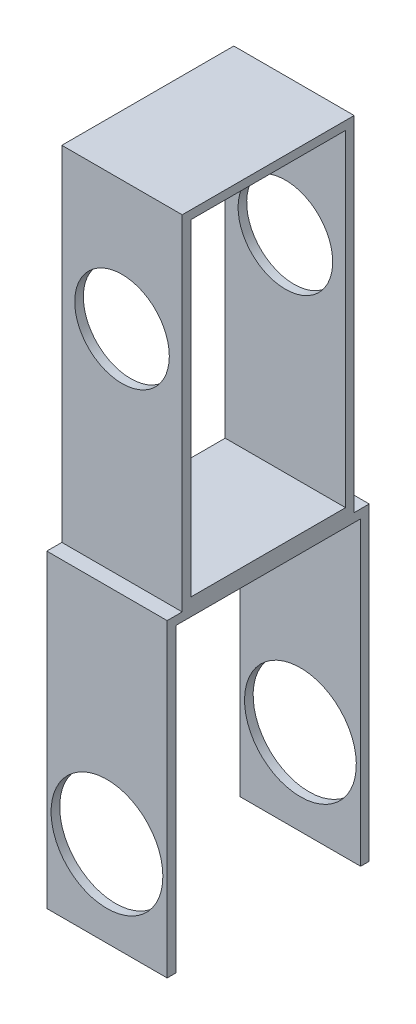
ISO-10303-21;
HEADER;
FILE_DESCRIPTION(('STEP AP214'),'2;1');
FILE_NAME('part.step','',(''),(''),'','','');
FILE_SCHEMA(('AUTOMOTIVE_DESIGN { 1 0 10303 214 1 1 1 1 }'));
ENDSEC;
DATA;
#1=APPLICATION_CONTEXT('core data for automotive mechanical design processes');
#2=APPLICATION_PROTOCOL_DEFINITION('international standard','automotive_design',2000,#1);
#3=PRODUCT_CONTEXT('',#1,'mechanical');
#4=PRODUCT('Part','Part','',(#3));
#5=PRODUCT_RELATED_PRODUCT_CATEGORY('part','',(#4));
#6=PRODUCT_DEFINITION_FORMATION('','',#4);
#7=PRODUCT_DEFINITION_CONTEXT('part definition',#1,'design');
#8=PRODUCT_DEFINITION('design','',#6,#7);
#9=PRODUCT_DEFINITION_SHAPE('','',#8);
#10=(LENGTH_UNIT() NAMED_UNIT(*) SI_UNIT(.MILLI.,.METRE.));
#11=(NAMED_UNIT(*) PLANE_ANGLE_UNIT() SI_UNIT($,.RADIAN.));
#12=(NAMED_UNIT(*) SI_UNIT($,.STERADIAN.) SOLID_ANGLE_UNIT());
#13=UNCERTAINTY_MEASURE_WITH_UNIT(LENGTH_MEASURE(1.E-05),#10,'distance_accuracy_value','');
#14=(GEOMETRIC_REPRESENTATION_CONTEXT(3) GLOBAL_UNCERTAINTY_ASSIGNED_CONTEXT((#13)) GLOBAL_UNIT_ASSIGNED_CONTEXT((#10,
#11,#12)) REPRESENTATION_CONTEXT('',''));
#15=CARTESIAN_POINT('',(0.,0.,0.));
#16=DIRECTION('',(0.,0.,1.));
#17=DIRECTION('',(1.,0.,0.));
#18=AXIS2_PLACEMENT_3D('',#15,#16,#17);
#19=CARTESIAN_POINT('',(14.,0.,40.));
#20=DIRECTION('',(1.,0.,0.));
#21=DIRECTION('',(0.,1.,0.));
#22=AXIS2_PLACEMENT_3D('',#19,#20,#21);
#23=PLANE('',#22);
#24=DIRECTION('',(0.,-1.,0.));
#25=VECTOR('',#24,1.);
#26=CARTESIAN_POINT('',(14.,0.,38.));
#27=LINE('',#26,#25);
#28=CARTESIAN_POINT('',(14.,73.9999999999998,38.));
#29=VERTEX_POINT('',#28);
#30=CARTESIAN_POINT('',(14.,-2.00000000000016,38.));
#31=VERTEX_POINT('',#30);
#32=EDGE_CURVE('E61',#29,#31,#27,.T.);
#33=ORIENTED_EDGE('',*,*,#32,.F.);
#34=DIRECTION('',(0.,0.,-1.));
#35=VECTOR('',#34,1.);
#36=CARTESIAN_POINT('',(14.,73.9999999999998,0.));
#37=LINE('',#36,#35);
#38=CARTESIAN_POINT('',(14.,73.9999999999998,2.00000000000001));
#39=VERTEX_POINT('',#38);
#40=EDGE_CURVE('E196',#29,#39,#37,.T.);
#41=ORIENTED_EDGE('',*,*,#40,.T.);
#42=DIRECTION('',(0.,-1.,0.));
#43=VECTOR('',#42,1.);
#44=CARTESIAN_POINT('',(14.,0.,2.));
#45=LINE('',#44,#43);
#46=CARTESIAN_POINT('',(14.,-2.00000000000016,2.));
#47=VERTEX_POINT('',#46);
#48=EDGE_CURVE('E209',#39,#47,#45,.T.);
#49=ORIENTED_EDGE('',*,*,#48,.T.);
#50=DIRECTION('',(0.,0.,-1.));
#51=VECTOR('',#50,1.);
#52=CARTESIAN_POINT('',(14.,-2.00000000000016,0.));
#53=LINE('',#52,#51);
#54=EDGE_CURVE('E206',#31,#47,#53,.T.);
#55=ORIENTED_EDGE('',*,*,#54,.F.);
#56=EDGE_LOOP('',(#33,#41,#49,#55));
#57=FACE_BOUND('',#56,.T.);
#58=DIRECTION('',(0.,0.,-1.));
#59=VECTOR('',#58,1.);
#60=CARTESIAN_POINT('',(14.,-6.00000000000015,0.));
#61=LINE('',#60,#59);
#62=CARTESIAN_POINT('',(14.,-6.00000000000015,41.5));
#63=VERTEX_POINT('',#62);
#64=CARTESIAN_POINT('',(14.,-6.00000000000015,-1.5));
#65=VERTEX_POINT('',#64);
#66=EDGE_CURVE('E175',#63,#65,#61,.T.);
#67=ORIENTED_EDGE('',*,*,#66,.T.);
#68=DIRECTION('',(0.,-1.,0.));
#69=VECTOR('',#68,1.);
#70=CARTESIAN_POINT('',(14.,0.,-1.5));
#71=LINE('',#70,#69);
#72=CARTESIAN_POINT('',(14.,-76.0000000000002,-1.50000000000001));
#73=VERTEX_POINT('',#72);
#74=EDGE_CURVE('E167',#65,#73,#71,.T.);
#75=ORIENTED_EDGE('',*,*,#74,.T.);
#76=DIRECTION('',(0.,0.,-1.));
#77=VECTOR('',#76,1.);
#78=CARTESIAN_POINT('',(14.,-76.0000000000002,43.5));
#79=LINE('',#78,#77);
#80=CARTESIAN_POINT('',(14.,-76.0000000000002,-3.5));
#81=VERTEX_POINT('',#80);
#82=EDGE_CURVE('E262',#73,#81,#79,.T.);
#83=ORIENTED_EDGE('',*,*,#82,.T.);
#84=DIRECTION('',(0.,-1.,0.));
#85=VECTOR('',#84,1.);
#86=CARTESIAN_POINT('',(14.,0.,-3.5));
#87=LINE('',#86,#85);
#88=CARTESIAN_POINT('',(14.,-4.00000000000016,-3.5));
#89=VERTEX_POINT('',#88);
#90=EDGE_CURVE('E231',#89,#81,#87,.T.);
#91=ORIENTED_EDGE('',*,*,#90,.F.);
#92=DIRECTION('',(0.,0.,1.));
#93=VECTOR('',#92,1.);
#94=CARTESIAN_POINT('',(14.,-4.00000000000016,-3.5));
#95=LINE('',#94,#93);
#96=CARTESIAN_POINT('',(14.,-4.00000000000016,0.));
#97=VERTEX_POINT('',#96);
#98=EDGE_CURVE('E242',#89,#97,#95,.T.);
#99=ORIENTED_EDGE('',*,*,#98,.T.);
#100=DIRECTION('',(0.,-1.,0.));
#101=VECTOR('',#100,1.);
#102=CARTESIAN_POINT('',(14.,0.,0.));
#103=LINE('',#102,#101);
#104=CARTESIAN_POINT('',(14.,75.9999999999998,0.));
#105=VERTEX_POINT('',#104);
#106=EDGE_CURVE('E293',#105,#97,#103,.T.);
#107=ORIENTED_EDGE('',*,*,#106,.F.);
#108=DIRECTION('',(0.,0.,-1.));
#109=VECTOR('',#108,1.);
#110=CARTESIAN_POINT('',(14.,75.9999999999998,40.));
#111=LINE('',#110,#109);
#112=CARTESIAN_POINT('',(14.,75.9999999999998,40.));
#113=VERTEX_POINT('',#112);
#114=EDGE_CURVE('E11',#113,#105,#111,.T.);
#115=ORIENTED_EDGE('',*,*,#114,.F.);
#116=DIRECTION('',(0.,-1.,0.));
#117=VECTOR('',#116,1.);
#118=CARTESIAN_POINT('',(14.,0.,40.));
#119=LINE('',#118,#117);
#120=CARTESIAN_POINT('',(14.,-4.00000000000016,40.));
#121=VERTEX_POINT('',#120);
#122=EDGE_CURVE('E283',#113,#121,#119,.T.);
#123=ORIENTED_EDGE('',*,*,#122,.T.);
#124=DIRECTION('',(0.,0.,-1.));
#125=VECTOR('',#124,1.);
#126=CARTESIAN_POINT('',(14.,-4.00000000000016,43.5));
#127=LINE('',#126,#125);
#128=CARTESIAN_POINT('',(14.,-4.00000000000016,43.5));
#129=VERTEX_POINT('',#128);
#130=EDGE_CURVE('E272',#129,#121,#127,.T.);
#131=ORIENTED_EDGE('',*,*,#130,.F.);
#132=DIRECTION('',(0.,-1.,0.));
#133=VECTOR('',#132,1.);
#134=CARTESIAN_POINT('',(14.,0.,43.5));
#135=LINE('',#134,#133);
#136=CARTESIAN_POINT('',(14.,-76.0000000000002,43.5));
#137=VERTEX_POINT('',#136);
#138=EDGE_CURVE('E251',#129,#137,#135,.T.);
#139=ORIENTED_EDGE('',*,*,#138,.T.);
#140=CARTESIAN_POINT('',(14.,-76.0000000000002,41.5));
#141=VERTEX_POINT('',#140);
#142=EDGE_CURVE('E263',#137,#141,#79,.T.);
#143=ORIENTED_EDGE('',*,*,#142,.T.);
#144=DIRECTION('',(0.,-1.,0.));
#145=VECTOR('',#144,1.);
#146=CARTESIAN_POINT('',(14.,0.,41.5));
#147=LINE('',#146,#145);
#148=EDGE_CURVE('E53',#63,#141,#147,.T.);
#149=ORIENTED_EDGE('',*,*,#148,.F.);
#150=EDGE_LOOP('',(#67,#75,#83,#91,#99,#107,#115,#123,#131,#139,#143,#149));
#151=FACE_BOUND('',#150,.T.);
#152=ADVANCED_FACE('F38',(#57,#151),#23,.T.);
#153=CARTESIAN_POINT('',(-14.,0.,40.));
#154=DIRECTION('',(1.,0.,0.));
#155=DIRECTION('',(0.,1.,0.));
#156=AXIS2_PLACEMENT_3D('',#153,#154,#155);
#157=PLANE('',#156);
#158=DIRECTION('',(0.,0.,-1.));
#159=VECTOR('',#158,1.);
#160=CARTESIAN_POINT('',(-14.,73.9999999999998,0.));
#161=LINE('',#160,#159);
#162=CARTESIAN_POINT('',(-14.,73.9999999999998,38.));
#163=VERTEX_POINT('',#162);
#164=CARTESIAN_POINT('',(-14.,73.9999999999998,2.00000000000001));
#165=VERTEX_POINT('',#164);
#166=EDGE_CURVE('E202',#163,#165,#161,.T.);
#167=ORIENTED_EDGE('',*,*,#166,.F.);
#168=DIRECTION('',(0.,-1.,0.));
#169=VECTOR('',#168,1.);
#170=CARTESIAN_POINT('',(-14.,0.,38.));
#171=LINE('',#170,#169);
#172=CARTESIAN_POINT('',(-14.,-2.00000000000017,38.));
#173=VERTEX_POINT('',#172);
#174=EDGE_CURVE('E192',#163,#173,#171,.T.);
#175=ORIENTED_EDGE('',*,*,#174,.T.);
#176=DIRECTION('',(0.,0.,-1.));
#177=VECTOR('',#176,1.);
#178=CARTESIAN_POINT('',(-14.,-2.00000000000017,0.));
#179=LINE('',#178,#177);
#180=CARTESIAN_POINT('',(-14.,-2.00000000000017,2.));
#181=VERTEX_POINT('',#180);
#182=EDGE_CURVE('E195',#173,#181,#179,.T.);
#183=ORIENTED_EDGE('',*,*,#182,.T.);
#184=DIRECTION('',(0.,-1.,0.));
#185=VECTOR('',#184,1.);
#186=CARTESIAN_POINT('',(-14.,0.,2.));
#187=LINE('',#186,#185);
#188=EDGE_CURVE('E199',#165,#181,#187,.T.);
#189=ORIENTED_EDGE('',*,*,#188,.F.);
#190=EDGE_LOOP('',(#167,#175,#183,#189));
#191=FACE_BOUND('',#190,.T.);
#192=DIRECTION('',(0.,-1.,0.));
#193=VECTOR('',#192,1.);
#194=CARTESIAN_POINT('',(-14.,0.,-1.5));
#195=LINE('',#194,#193);
#196=CARTESIAN_POINT('',(-14.,-6.00000000000016,-1.5));
#197=VERTEX_POINT('',#196);
#198=CARTESIAN_POINT('',(-14.,-76.0000000000002,-1.50000000000001));
#199=VERTEX_POINT('',#198);
#200=EDGE_CURVE('E161',#197,#199,#195,.T.);
#201=ORIENTED_EDGE('',*,*,#200,.F.);
#202=DIRECTION('',(0.,0.,-1.));
#203=VECTOR('',#202,1.);
#204=CARTESIAN_POINT('',(-14.,-6.00000000000016,0.));
#205=LINE('',#204,#203);
#206=CARTESIAN_POINT('',(-14.,-6.00000000000016,41.5));
#207=VERTEX_POINT('',#206);
#208=EDGE_CURVE('E149',#207,#197,#205,.T.);
#209=ORIENTED_EDGE('',*,*,#208,.F.);
#210=DIRECTION('',(0.,-1.,0.));
#211=VECTOR('',#210,1.);
#212=CARTESIAN_POINT('',(-14.,0.,41.5));
#213=LINE('',#212,#211);
#214=CARTESIAN_POINT('',(-14.,-76.0000000000002,41.5));
#215=VERTEX_POINT('',#214);
#216=EDGE_CURVE('E160',#207,#215,#213,.T.);
#217=ORIENTED_EDGE('',*,*,#216,.T.);
#218=DIRECTION('',(0.,0.,-1.));
#219=VECTOR('',#218,1.);
#220=CARTESIAN_POINT('',(-14.,-76.0000000000002,43.5));
#221=LINE('',#220,#219);
#222=CARTESIAN_POINT('',(-14.,-76.0000000000002,43.5));
#223=VERTEX_POINT('',#222);
#224=EDGE_CURVE('E266',#223,#215,#221,.T.);
#225=ORIENTED_EDGE('',*,*,#224,.F.);
#226=DIRECTION('',(0.,-1.,0.));
#227=VECTOR('',#226,1.);
#228=CARTESIAN_POINT('',(-14.,0.,43.5));
#229=LINE('',#228,#227);
#230=CARTESIAN_POINT('',(-14.,-4.00000000000016,43.5));
#231=VERTEX_POINT('',#230);
#232=EDGE_CURVE('E257',#231,#223,#229,.T.);
#233=ORIENTED_EDGE('',*,*,#232,.F.);
#234=DIRECTION('',(0.,0.,-1.));
#235=VECTOR('',#234,1.);
#236=CARTESIAN_POINT('',(-14.,-4.00000000000016,43.5));
#237=LINE('',#236,#235);
#238=CARTESIAN_POINT('',(-14.,-4.00000000000016,40.));
#239=VERTEX_POINT('',#238);
#240=EDGE_CURVE('E269',#231,#239,#237,.T.);
#241=ORIENTED_EDGE('',*,*,#240,.T.);
#242=DIRECTION('',(0.,-1.,0.));
#243=VECTOR('',#242,1.);
#244=CARTESIAN_POINT('',(-14.,0.,40.));
#245=LINE('',#244,#243);
#246=CARTESIAN_POINT('',(-14.,75.9999999999998,40.));
#247=VERTEX_POINT('',#246);
#248=EDGE_CURVE('E289',#247,#239,#245,.T.);
#249=ORIENTED_EDGE('',*,*,#248,.F.);
#250=DIRECTION('',(0.,0.,-1.));
#251=VECTOR('',#250,1.);
#252=CARTESIAN_POINT('',(-14.,75.9999999999998,40.));
#253=LINE('',#252,#251);
#254=CARTESIAN_POINT('',(-14.,75.9999999999998,0.));
#255=VERTEX_POINT('',#254);
#256=EDGE_CURVE('E46',#247,#255,#253,.T.);
#257=ORIENTED_EDGE('',*,*,#256,.T.);
#258=DIRECTION('',(0.,-1.,0.));
#259=VECTOR('',#258,1.);
#260=CARTESIAN_POINT('',(-14.,0.,0.));
#261=LINE('',#260,#259);
#262=CARTESIAN_POINT('',(-14.,-4.00000000000016,0.));
#263=VERTEX_POINT('',#262);
#264=EDGE_CURVE('E280',#255,#263,#261,.T.);
#265=ORIENTED_EDGE('',*,*,#264,.T.);
#266=DIRECTION('',(0.,0.,1.));
#267=VECTOR('',#266,1.);
#268=CARTESIAN_POINT('',(-14.,-4.00000000000016,-3.5));
#269=LINE('',#268,#267);
#270=CARTESIAN_POINT('',(-14.,-4.00000000000016,-3.5));
#271=VERTEX_POINT('',#270);
#272=EDGE_CURVE('E245',#271,#263,#269,.T.);
#273=ORIENTED_EDGE('',*,*,#272,.F.);
#274=DIRECTION('',(0.,-1.,0.));
#275=VECTOR('',#274,1.);
#276=CARTESIAN_POINT('',(-14.,0.,-3.5));
#277=LINE('',#276,#275);
#278=CARTESIAN_POINT('',(-14.,-76.0000000000002,-3.5));
#279=VERTEX_POINT('',#278);
#280=EDGE_CURVE('E237',#271,#279,#277,.T.);
#281=ORIENTED_EDGE('',*,*,#280,.T.);
#282=EDGE_CURVE('E173',#199,#279,#221,.T.);
#283=ORIENTED_EDGE('',*,*,#282,.F.);
#284=EDGE_LOOP('',(#201,#209,#217,#225,#233,#241,#249,#257,#265,#273,#281,#283));
#285=FACE_BOUND('',#284,.T.);
#286=ADVANCED_FACE('F171',(#191,#285),#157,.F.);
#287=CARTESIAN_POINT('',(0.,-56.0000000000001,43.5));
#288=DIRECTION('',(0.,0.,-1.));
#289=DIRECTION('',(-1.,0.,0.));
#290=AXIS2_PLACEMENT_3D('',#287,#288,#289);
#291=CYLINDRICAL_SURFACE('',#290,13.);
#292=CARTESIAN_POINT('',(0.,-56.0000000000001,-3.5));
#293=DIRECTION('',(0.,0.,1.));
#294=DIRECTION('',(1.,0.,0.));
#295=AXIS2_PLACEMENT_3D('',#292,#293,#294);
#296=CIRCLE('',#295,13.);
#297=CARTESIAN_POINT('',(13.,-56.0000000000001,-3.5));
#298=VERTEX_POINT('',#297);
#299=EDGE_CURVE('E228',#298,#298,#296,.T.);
#300=ORIENTED_EDGE('',*,*,#299,.F.);
#301=EDGE_LOOP('',(#300));
#302=FACE_BOUND('',#301,.T.);
#303=CARTESIAN_POINT('',(0.,-56.0000000000001,-1.50000000000001));
#304=DIRECTION('',(0.,0.,1.));
#305=DIRECTION('',(0.,-1.,0.));
#306=AXIS2_PLACEMENT_3D('',#303,#304,#305);
#307=CIRCLE('',#306,13.);
#308=CARTESIAN_POINT('',(0.,-69.0000000000001,-1.50000000000001));
#309=VERTEX_POINT('',#308);
#310=EDGE_CURVE('E189',#309,#309,#307,.T.);
#311=ORIENTED_EDGE('',*,*,#310,.T.);
#312=EDGE_LOOP('',(#311));
#313=FACE_BOUND('',#312,.T.);
#314=ADVANCED_FACE('F355',(#302,#313),#291,.F.);
#315=CARTESIAN_POINT('',(0.,-76.0000000000002,43.5));
#316=DIRECTION('',(0.,1.,0.));
#317=DIRECTION('',(0.,0.,1.));
#318=AXIS2_PLACEMENT_3D('',#315,#316,#317);
#319=PLANE('',#318);
#320=DIRECTION('',(1.,0.,0.));
#321=VECTOR('',#320,1.);
#322=CARTESIAN_POINT('',(-14.,-76.0000000000002,-1.50000000000001));
#323=LINE('',#322,#321);
#324=EDGE_CURVE('E181',#199,#73,#323,.T.);
#325=ORIENTED_EDGE('',*,*,#324,.F.);
#326=ORIENTED_EDGE('',*,*,#282,.T.);
#327=DIRECTION('',(1.,0.,0.));
#328=VECTOR('',#327,1.);
#329=CARTESIAN_POINT('',(0.,-76.0000000000002,-3.5));
#330=LINE('',#329,#328);
#331=EDGE_CURVE('E239',#279,#81,#330,.T.);
#332=ORIENTED_EDGE('',*,*,#331,.T.);
#333=ORIENTED_EDGE('',*,*,#82,.F.);
#334=EDGE_LOOP('',(#325,#326,#332,#333));
#335=FACE_BOUND('',#334,.T.);
#336=ADVANCED_FACE('F322',(#335),#319,.F.);
#337=CARTESIAN_POINT('',(0.,45.9999999999998,40.));
#338=DIRECTION('',(0.,0.,-1.));
#339=DIRECTION('',(-1.,0.,0.));
#340=AXIS2_PLACEMENT_3D('',#337,#338,#339);
#341=CYLINDRICAL_SURFACE('',#340,11.);
#342=CARTESIAN_POINT('',(0.,45.9999999999998,0.));
#343=DIRECTION('',(0.,0.,1.));
#344=DIRECTION('',(1.,0.,0.));
#345=AXIS2_PLACEMENT_3D('',#342,#343,#344);
#346=CIRCLE('',#345,11.);
#347=CARTESIAN_POINT('',(11.,45.9999999999998,0.));
#348=VERTEX_POINT('',#347);
#349=EDGE_CURVE('E275',#348,#348,#346,.T.);
#350=ORIENTED_EDGE('',*,*,#349,.F.);
#351=EDGE_LOOP('',(#350));
#352=FACE_BOUND('',#351,.T.);
#353=CARTESIAN_POINT('',(0.,45.9999999999998,2.00000000000001));
#354=DIRECTION('',(0.,0.,1.));
#355=DIRECTION('',(0.,-1.,0.));
#356=AXIS2_PLACEMENT_3D('',#353,#354,#355);
#357=CIRCLE('',#356,11.);
#358=CARTESIAN_POINT('',(0.,34.9999999999999,2.00000000000001));
#359=VERTEX_POINT('',#358);
#360=EDGE_CURVE('E216',#359,#359,#357,.T.);
#361=ORIENTED_EDGE('',*,*,#360,.T.);
#362=EDGE_LOOP('',(#361));
#363=FACE_BOUND('',#362,.T.);
#364=ADVANCED_FACE('F347',(#352,#363),#341,.F.);
#365=CARTESIAN_POINT('',(0.,75.9999999999998,40.));
#366=DIRECTION('',(0.,1.,0.));
#367=DIRECTION('',(0.,0.,1.));
#368=AXIS2_PLACEMENT_3D('',#365,#366,#367);
#369=PLANE('',#368);
#370=DIRECTION('',(1.,0.,0.));
#371=VECTOR('',#370,1.);
#372=CARTESIAN_POINT('',(0.,75.9999999999998,0.));
#373=LINE('',#372,#371);
#374=EDGE_CURVE('E296',#255,#105,#373,.T.);
#375=ORIENTED_EDGE('',*,*,#374,.F.);
#376=ORIENTED_EDGE('',*,*,#256,.F.);
#377=DIRECTION('',(1.,0.,0.));
#378=VECTOR('',#377,1.);
#379=CARTESIAN_POINT('',(0.,75.9999999999998,40.));
#380=LINE('',#379,#378);
#381=EDGE_CURVE('E286',#247,#113,#380,.T.);
#382=ORIENTED_EDGE('',*,*,#381,.T.);
#383=ORIENTED_EDGE('',*,*,#114,.T.);
#384=EDGE_LOOP('',(#375,#376,#382,#383));
#385=FACE_BOUND('',#384,.T.);
#386=ADVANCED_FACE('F308',(#385),#369,.T.);
#387=CARTESIAN_POINT('',(0.,45.9999999999998,38.));
#388=DIRECTION('',(0.,0.,1.));
#389=DIRECTION('',(0.,-1.,0.));
#390=AXIS2_PLACEMENT_3D('',#387,#388,#389);
#391=CIRCLE('',#390,11.);
#392=CARTESIAN_POINT('',(0.,34.9999999999999,38.));
#393=VERTEX_POINT('',#392);
#394=EDGE_CURVE('E224',#393,#393,#391,.T.);
#395=ORIENTED_EDGE('',*,*,#394,.F.);
#396=EDGE_LOOP('',(#395));
#397=FACE_BOUND('',#396,.T.);
#398=CARTESIAN_POINT('',(0.,45.9999999999998,40.));
#399=DIRECTION('',(0.,0.,1.));
#400=DIRECTION('',(1.,0.,0.));
#401=AXIS2_PLACEMENT_3D('',#398,#399,#400);
#402=CIRCLE('',#401,11.);
#403=CARTESIAN_POINT('',(11.,45.9999999999998,40.));
#404=VERTEX_POINT('',#403);
#405=EDGE_CURVE('E276',#404,#404,#402,.T.);
#406=ORIENTED_EDGE('',*,*,#405,.T.);
#407=EDGE_LOOP('',(#406));
#408=FACE_BOUND('',#407,.T.);
#409=ADVANCED_FACE('F40',(#397,#408),#341,.F.);
#410=CARTESIAN_POINT('',(0.,0.,40.));
#411=DIRECTION('',(0.,0.,1.));
#412=DIRECTION('',(1.,0.,0.));
#413=AXIS2_PLACEMENT_3D('',#410,#411,#412);
#414=PLANE('',#413);
#415=ORIENTED_EDGE('',*,*,#405,.F.);
#416=EDGE_LOOP('',(#415));
#417=FACE_BOUND('',#416,.T.);
#418=DIRECTION('',(-1.,0.,0.));
#419=VECTOR('',#418,1.);
#420=CARTESIAN_POINT('',(0.,-4.00000000000016,40.));
#421=LINE('',#420,#419);
#422=EDGE_CURVE('E279',#121,#239,#421,.T.);
#423=ORIENTED_EDGE('',*,*,#422,.F.);
#424=ORIENTED_EDGE('',*,*,#122,.F.);
#425=ORIENTED_EDGE('',*,*,#381,.F.);
#426=ORIENTED_EDGE('',*,*,#248,.T.);
#427=EDGE_LOOP('',(#423,#424,#425,#426));
#428=FACE_BOUND('',#427,.T.);
#429=ADVANCED_FACE('F336',(#417,#428),#414,.T.);
#430=CARTESIAN_POINT('',(0.,0.,0.));
#431=DIRECTION('',(0.,0.,1.));
#432=DIRECTION('',(1.,0.,0.));
#433=AXIS2_PLACEMENT_3D('',#430,#431,#432);
#434=PLANE('',#433);
#435=ORIENTED_EDGE('',*,*,#349,.T.);
#436=EDGE_LOOP('',(#435));
#437=FACE_BOUND('',#436,.T.);
#438=ORIENTED_EDGE('',*,*,#106,.T.);
#439=DIRECTION('',(-1.,0.,0.));
#440=VECTOR('',#439,1.);
#441=CARTESIAN_POINT('',(0.,-4.00000000000016,0.));
#442=LINE('',#441,#440);
#443=EDGE_CURVE('E227',#97,#263,#442,.T.);
#444=ORIENTED_EDGE('',*,*,#443,.T.);
#445=ORIENTED_EDGE('',*,*,#264,.F.);
#446=ORIENTED_EDGE('',*,*,#374,.T.);
#447=EDGE_LOOP('',(#438,#444,#445,#446));
#448=FACE_BOUND('',#447,.T.);
#449=ADVANCED_FACE('F306',(#437,#448),#434,.F.);
#450=CARTESIAN_POINT('',(0.,-4.00000000000016,43.5));
#451=DIRECTION('',(0.,-1.,0.));
#452=DIRECTION('',(0.,0.,-1.));
#453=AXIS2_PLACEMENT_3D('',#450,#451,#452);
#454=PLANE('',#453);
#455=ORIENTED_EDGE('',*,*,#130,.T.);
#456=ORIENTED_EDGE('',*,*,#422,.T.);
#457=ORIENTED_EDGE('',*,*,#240,.F.);
#458=DIRECTION('',(-1.,0.,0.));
#459=VECTOR('',#458,1.);
#460=CARTESIAN_POINT('',(0.,-4.00000000000016,43.5));
#461=LINE('',#460,#459);
#462=EDGE_CURVE('E254',#129,#231,#461,.T.);
#463=ORIENTED_EDGE('',*,*,#462,.F.);
#464=EDGE_LOOP('',(#455,#456,#457,#463));
#465=FACE_BOUND('',#464,.T.);
#466=ADVANCED_FACE('F334',(#465),#454,.F.);
#467=CARTESIAN_POINT('',(0.,-56.0000000000001,41.5));
#468=DIRECTION('',(0.,0.,1.));
#469=DIRECTION('',(1.,0.,0.));
#470=AXIS2_PLACEMENT_3D('',#467,#468,#469);
#471=CIRCLE('',#470,13.);
#472=CARTESIAN_POINT('',(13.,-56.0000000000001,41.5));
#473=VERTEX_POINT('',#472);
#474=EDGE_CURVE('E183',#473,#473,#471,.T.);
#475=ORIENTED_EDGE('',*,*,#474,.F.);
#476=EDGE_LOOP('',(#475));
#477=FACE_BOUND('',#476,.T.);
#478=CARTESIAN_POINT('',(0.,-56.0000000000001,43.5));
#479=DIRECTION('',(0.,0.,1.));
#480=DIRECTION('',(1.,0.,0.));
#481=AXIS2_PLACEMENT_3D('',#478,#479,#480);
#482=CIRCLE('',#481,13.);
#483=CARTESIAN_POINT('',(13.,-56.0000000000001,43.5));
#484=VERTEX_POINT('',#483);
#485=EDGE_CURVE('E247',#484,#484,#482,.T.);
#486=ORIENTED_EDGE('',*,*,#485,.T.);
#487=EDGE_LOOP('',(#486));
#488=FACE_BOUND('',#487,.T.);
#489=ADVANCED_FACE('F407',(#477,#488),#291,.F.);
#490=ORIENTED_EDGE('',*,*,#224,.T.);
#491=DIRECTION('',(1.,0.,0.));
#492=VECTOR('',#491,1.);
#493=CARTESIAN_POINT('',(-14.,-76.0000000000002,41.5));
#494=LINE('',#493,#492);
#495=EDGE_CURVE('E184',#215,#141,#494,.T.);
#496=ORIENTED_EDGE('',*,*,#495,.T.);
#497=ORIENTED_EDGE('',*,*,#142,.F.);
#498=DIRECTION('',(1.,0.,0.));
#499=VECTOR('',#498,1.);
#500=CARTESIAN_POINT('',(0.,-76.0000000000002,43.5));
#501=LINE('',#500,#499);
#502=EDGE_CURVE('E260',#223,#137,#501,.T.);
#503=ORIENTED_EDGE('',*,*,#502,.F.);
#504=EDGE_LOOP('',(#490,#496,#497,#503));
#505=FACE_BOUND('',#504,.T.);
#506=ADVANCED_FACE('F326',(#505),#319,.F.);
#507=CARTESIAN_POINT('',(0.,0.,43.5));
#508=DIRECTION('',(0.,0.,1.));
#509=DIRECTION('',(1.,0.,0.));
#510=AXIS2_PLACEMENT_3D('',#507,#508,#509);
#511=PLANE('',#510);
#512=ORIENTED_EDGE('',*,*,#485,.F.);
#513=EDGE_LOOP('',(#512));
#514=FACE_BOUND('',#513,.T.);
#515=ORIENTED_EDGE('',*,*,#138,.F.);
#516=ORIENTED_EDGE('',*,*,#462,.T.);
#517=ORIENTED_EDGE('',*,*,#232,.T.);
#518=ORIENTED_EDGE('',*,*,#502,.T.);
#519=EDGE_LOOP('',(#515,#516,#517,#518));
#520=FACE_BOUND('',#519,.T.);
#521=ADVANCED_FACE('F332',(#514,#520),#511,.T.);
#522=CARTESIAN_POINT('',(0.,-4.00000000000016,-3.5));
#523=DIRECTION('',(0.,1.,0.));
#524=DIRECTION('',(0.,0.,1.));
#525=AXIS2_PLACEMENT_3D('',#522,#523,#524);
#526=PLANE('',#525);
#527=ORIENTED_EDGE('',*,*,#443,.F.);
#528=ORIENTED_EDGE('',*,*,#98,.F.);
#529=DIRECTION('',(-1.,0.,0.));
#530=VECTOR('',#529,1.);
#531=CARTESIAN_POINT('',(0.,-4.00000000000016,-3.5));
#532=LINE('',#531,#530);
#533=EDGE_CURVE('E234',#89,#271,#532,.T.);
#534=ORIENTED_EDGE('',*,*,#533,.T.);
#535=ORIENTED_EDGE('',*,*,#272,.T.);
#536=EDGE_LOOP('',(#527,#528,#534,#535));
#537=FACE_BOUND('',#536,.T.);
#538=ADVANCED_FACE('F315',(#537),#526,.T.);
#539=CARTESIAN_POINT('',(0.,0.,-3.5));
#540=DIRECTION('',(0.,0.,1.));
#541=DIRECTION('',(1.,0.,0.));
#542=AXIS2_PLACEMENT_3D('',#539,#540,#541);
#543=PLANE('',#542);
#544=ORIENTED_EDGE('',*,*,#299,.T.);
#545=EDGE_LOOP('',(#544));
#546=FACE_BOUND('',#545,.T.);
#547=ORIENTED_EDGE('',*,*,#90,.T.);
#548=ORIENTED_EDGE('',*,*,#331,.F.);
#549=ORIENTED_EDGE('',*,*,#280,.F.);
#550=ORIENTED_EDGE('',*,*,#533,.F.);
#551=EDGE_LOOP('',(#547,#548,#549,#550));
#552=FACE_BOUND('',#551,.T.);
#553=ADVANCED_FACE('F319',(#546,#552),#543,.F.);
#554=CARTESIAN_POINT('',(-14.,0.,38.));
#555=DIRECTION('',(0.,0.,1.));
#556=DIRECTION('',(0.,-1.,0.));
#557=AXIS2_PLACEMENT_3D('',#554,#555,#556);
#558=PLANE('',#557);
#559=ORIENTED_EDGE('',*,*,#394,.T.);
#560=EDGE_LOOP('',(#559));
#561=FACE_BOUND('',#560,.T.);
#562=ORIENTED_EDGE('',*,*,#32,.T.);
#563=DIRECTION('',(1.,0.,0.));
#564=VECTOR('',#563,1.);
#565=CARTESIAN_POINT('',(-14.,-2.00000000000017,38.));
#566=LINE('',#565,#564);
#567=EDGE_CURVE('E204',#173,#31,#566,.T.);
#568=ORIENTED_EDGE('',*,*,#567,.F.);
#569=ORIENTED_EDGE('',*,*,#174,.F.);
#570=DIRECTION('',(1.,0.,0.));
#571=VECTOR('',#570,1.);
#572=CARTESIAN_POINT('',(-14.,73.9999999999998,38.));
#573=LINE('',#572,#571);
#574=EDGE_CURVE('E214',#163,#29,#573,.T.);
#575=ORIENTED_EDGE('',*,*,#574,.T.);
#576=EDGE_LOOP('',(#562,#568,#569,#575));
#577=FACE_BOUND('',#576,.T.);
#578=ADVANCED_FACE('F388',(#561,#577),#558,.F.);
#579=CARTESIAN_POINT('',(-14.,73.9999999999998,0.));
#580=DIRECTION('',(0.,-1.,0.));
#581=DIRECTION('',(1.,0.,0.));
#582=AXIS2_PLACEMENT_3D('',#579,#580,#581);
#583=PLANE('',#582);
#584=ORIENTED_EDGE('',*,*,#40,.F.);
#585=ORIENTED_EDGE('',*,*,#574,.F.);
#586=ORIENTED_EDGE('',*,*,#166,.T.);
#587=DIRECTION('',(1.,0.,0.));
#588=VECTOR('',#587,1.);
#589=CARTESIAN_POINT('',(-14.,73.9999999999998,2.00000000000001));
#590=LINE('',#589,#588);
#591=EDGE_CURVE('E217',#165,#39,#590,.T.);
#592=ORIENTED_EDGE('',*,*,#591,.T.);
#593=EDGE_LOOP('',(#584,#585,#586,#592));
#594=FACE_BOUND('',#593,.T.);
#595=ADVANCED_FACE('F376',(#594),#583,.T.);
#596=CARTESIAN_POINT('',(-14.,0.,2.));
#597=DIRECTION('',(0.,0.,1.));
#598=DIRECTION('',(0.,-1.,0.));
#599=AXIS2_PLACEMENT_3D('',#596,#597,#598);
#600=PLANE('',#599);
#601=ORIENTED_EDGE('',*,*,#360,.F.);
#602=EDGE_LOOP('',(#601));
#603=FACE_BOUND('',#602,.T.);
#604=ORIENTED_EDGE('',*,*,#48,.F.);
#605=ORIENTED_EDGE('',*,*,#591,.F.);
#606=ORIENTED_EDGE('',*,*,#188,.T.);
#607=DIRECTION('',(1.,0.,0.));
#608=VECTOR('',#607,1.);
#609=CARTESIAN_POINT('',(-14.,-2.00000000000017,2.));
#610=LINE('',#609,#608);
#611=EDGE_CURVE('E219',#181,#47,#610,.T.);
#612=ORIENTED_EDGE('',*,*,#611,.T.);
#613=EDGE_LOOP('',(#604,#605,#606,#612));
#614=FACE_BOUND('',#613,.T.);
#615=ADVANCED_FACE('F372',(#603,#614),#600,.T.);
#616=CARTESIAN_POINT('',(-14.,-2.00000000000017,0.));
#617=DIRECTION('',(0.,-1.,0.));
#618=DIRECTION('',(1.,0.,0.));
#619=AXIS2_PLACEMENT_3D('',#616,#617,#618);
#620=PLANE('',#619);
#621=ORIENTED_EDGE('',*,*,#54,.T.);
#622=ORIENTED_EDGE('',*,*,#611,.F.);
#623=ORIENTED_EDGE('',*,*,#182,.F.);
#624=ORIENTED_EDGE('',*,*,#567,.T.);
#625=EDGE_LOOP('',(#621,#622,#623,#624));
#626=FACE_BOUND('',#625,.T.);
#627=ADVANCED_FACE('F375',(#626),#620,.F.);
#628=CARTESIAN_POINT('',(-14.,0.,-1.5));
#629=DIRECTION('',(0.,0.,1.));
#630=DIRECTION('',(0.,-1.,0.));
#631=AXIS2_PLACEMENT_3D('',#628,#629,#630);
#632=PLANE('',#631);
#633=ORIENTED_EDGE('',*,*,#310,.F.);
#634=EDGE_LOOP('',(#633));
#635=FACE_BOUND('',#634,.T.);
#636=ORIENTED_EDGE('',*,*,#74,.F.);
#637=DIRECTION('',(1.,0.,0.));
#638=VECTOR('',#637,1.);
#639=CARTESIAN_POINT('',(-14.,-6.00000000000016,-1.5));
#640=LINE('',#639,#638);
#641=EDGE_CURVE('E153',#197,#65,#640,.T.);
#642=ORIENTED_EDGE('',*,*,#641,.F.);
#643=ORIENTED_EDGE('',*,*,#200,.T.);
#644=ORIENTED_EDGE('',*,*,#324,.T.);
#645=EDGE_LOOP('',(#636,#642,#643,#644));
#646=FACE_BOUND('',#645,.T.);
#647=ADVANCED_FACE('F164',(#635,#646),#632,.T.);
#648=CARTESIAN_POINT('',(-14.,0.,41.5));
#649=DIRECTION('',(0.,0.,1.));
#650=DIRECTION('',(1.,0.,0.));
#651=AXIS2_PLACEMENT_3D('',#648,#649,#650);
#652=PLANE('',#651);
#653=ORIENTED_EDGE('',*,*,#474,.T.);
#654=EDGE_LOOP('',(#653));
#655=FACE_BOUND('',#654,.T.);
#656=ORIENTED_EDGE('',*,*,#148,.T.);
#657=ORIENTED_EDGE('',*,*,#495,.F.);
#658=ORIENTED_EDGE('',*,*,#216,.F.);
#659=DIRECTION('',(1.,0.,0.));
#660=VECTOR('',#659,1.);
#661=CARTESIAN_POINT('',(-14.,-6.00000000000016,41.5));
#662=LINE('',#661,#660);
#663=EDGE_CURVE('E155',#207,#63,#662,.T.);
#664=ORIENTED_EDGE('',*,*,#663,.T.);
#665=EDGE_LOOP('',(#656,#657,#658,#664));
#666=FACE_BOUND('',#665,.T.);
#667=ADVANCED_FACE('F328',(#655,#666),#652,.F.);
#668=CARTESIAN_POINT('',(-14.,-6.00000000000016,0.));
#669=DIRECTION('',(0.,-1.,0.));
#670=DIRECTION('',(1.,0.,0.));
#671=AXIS2_PLACEMENT_3D('',#668,#669,#670);
#672=PLANE('',#671);
#673=ORIENTED_EDGE('',*,*,#66,.F.);
#674=ORIENTED_EDGE('',*,*,#663,.F.);
#675=ORIENTED_EDGE('',*,*,#208,.T.);
#676=ORIENTED_EDGE('',*,*,#641,.T.);
#677=EDGE_LOOP('',(#673,#674,#675,#676));
#678=FACE_BOUND('',#677,.T.);
#679=ADVANCED_FACE('F152',(#678),#672,.T.);
#680=CLOSED_SHELL('',(#152,#286,#314,#336,#364,#386,#409,#429,#449,#466,#489,#506,#521,#538,
#553,#578,#595,#615,#627,#647,#667,#679));
#681=MANIFOLD_SOLID_BREP('B2',#680);
#682=ADVANCED_BREP_SHAPE_REPRESENTATION('',(#18,#681),#14);
#683=SHAPE_DEFINITION_REPRESENTATION(#9,#682);
ENDSEC;
END-ISO-10303-21;
